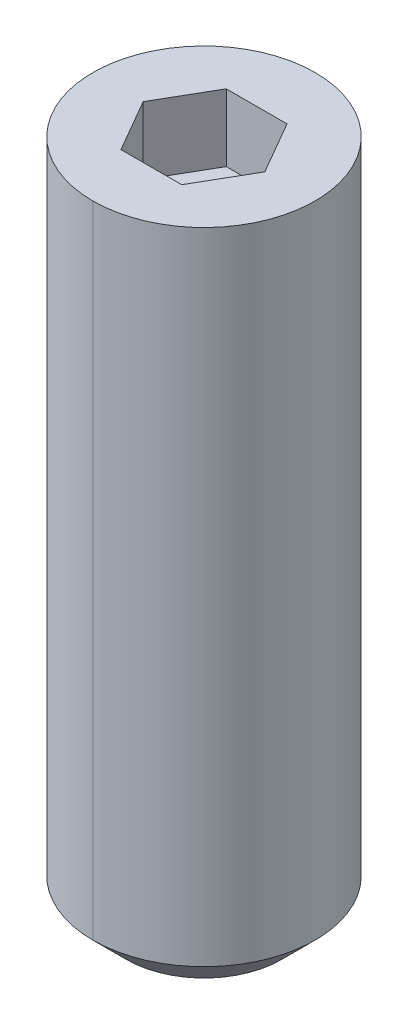
ISO-10303-21;
HEADER;
FILE_DESCRIPTION(('STEP AP214'),'2;1');
FILE_NAME('part.step','',(''),(''),'','','');
FILE_SCHEMA(('AUTOMOTIVE_DESIGN { 1 0 10303 214 1 1 1 1 }'));
ENDSEC;
DATA;
#1=APPLICATION_CONTEXT('core data for automotive mechanical design processes');
#2=APPLICATION_PROTOCOL_DEFINITION('international standard','automotive_design',2000,#1);
#3=PRODUCT_CONTEXT('',#1,'mechanical');
#4=PRODUCT('Part','Part','',(#3));
#5=PRODUCT_RELATED_PRODUCT_CATEGORY('part','',(#4));
#6=PRODUCT_DEFINITION_FORMATION('','',#4);
#7=PRODUCT_DEFINITION_CONTEXT('part definition',#1,'design');
#8=PRODUCT_DEFINITION('design','',#6,#7);
#9=PRODUCT_DEFINITION_SHAPE('','',#8);
#10=(LENGTH_UNIT() NAMED_UNIT(*) SI_UNIT(.MILLI.,.METRE.));
#11=(NAMED_UNIT(*) PLANE_ANGLE_UNIT() SI_UNIT($,.RADIAN.));
#12=(NAMED_UNIT(*) SI_UNIT($,.STERADIAN.) SOLID_ANGLE_UNIT());
#13=UNCERTAINTY_MEASURE_WITH_UNIT(LENGTH_MEASURE(1.E-05),#10,'distance_accuracy_value','');
#14=(GEOMETRIC_REPRESENTATION_CONTEXT(3) GLOBAL_UNCERTAINTY_ASSIGNED_CONTEXT((#13)) GLOBAL_UNIT_ASSIGNED_CONTEXT((#10,
#11,#12)) REPRESENTATION_CONTEXT('',''));
#15=CARTESIAN_POINT('',(0.,0.,0.));
#16=DIRECTION('',(0.,0.,1.));
#17=DIRECTION('',(1.,0.,0.));
#18=AXIS2_PLACEMENT_3D('',#15,#16,#17);
#19=CARTESIAN_POINT('',(-1.14567944042316,5.08,0.));
#20=DIRECTION('',(0.,1.,0.));
#21=DIRECTION('',(1.,0.,0.));
#22=AXIS2_PLACEMENT_3D('',#19,#20,#21);
#23=PLANE('',#22);
#24=DIRECTION('',(-0.5,0.,0.866025403784439));
#25=VECTOR('',#24,1.);
#26=CARTESIAN_POINT('',(-0.572839720211583,5.08,-0.9921875));
#27=LINE('',#26,#25);
#28=CARTESIAN_POINT('',(-0.572839720211583,5.08,-0.9921875));
#29=VERTEX_POINT('',#28);
#30=CARTESIAN_POINT('',(-1.14567944042316,5.08,0.));
#31=VERTEX_POINT('',#30);
#32=EDGE_CURVE('E10',#29,#31,#27,.T.);
#33=ORIENTED_EDGE('',*,*,#32,.T.);
#34=DIRECTION('',(0.5,0.,0.866025403784439));
#35=VECTOR('',#34,1.);
#36=CARTESIAN_POINT('',(-1.14567944042316,5.08,0.));
#37=LINE('',#36,#35);
#38=CARTESIAN_POINT('',(-0.572839720211581,5.08,0.9921875));
#39=VERTEX_POINT('',#38);
#40=EDGE_CURVE('E164',#31,#39,#37,.T.);
#41=ORIENTED_EDGE('',*,*,#40,.T.);
#42=DIRECTION('',(1.,0.,0.));
#43=VECTOR('',#42,1.);
#44=CARTESIAN_POINT('',(-0.572839720211581,5.08,0.9921875));
#45=LINE('',#44,#43);
#46=CARTESIAN_POINT('',(0.572839720211582,5.08,0.9921875));
#47=VERTEX_POINT('',#46);
#48=EDGE_CURVE('E192',#39,#47,#45,.T.);
#49=ORIENTED_EDGE('',*,*,#48,.T.);
#50=DIRECTION('',(0.5,0.,-0.866025403784439));
#51=VECTOR('',#50,1.);
#52=CARTESIAN_POINT('',(0.572839720211582,5.08,0.9921875));
#53=LINE('',#52,#51);
#54=CARTESIAN_POINT('',(1.14567944042316,5.08,0.));
#55=VERTEX_POINT('',#54);
#56=EDGE_CURVE('E151',#47,#55,#53,.T.);
#57=ORIENTED_EDGE('',*,*,#56,.T.);
#58=DIRECTION('',(-0.5,0.,-0.866025403784438));
#59=VECTOR('',#58,1.);
#60=CARTESIAN_POINT('',(1.14567944042316,5.08,0.));
#61=LINE('',#60,#59);
#62=CARTESIAN_POINT('',(0.572839720211582,5.08,-0.9921875));
#63=VERTEX_POINT('',#62);
#64=EDGE_CURVE('E27',#55,#63,#61,.T.);
#65=ORIENTED_EDGE('',*,*,#64,.T.);
#66=DIRECTION('',(-1.,0.,0.));
#67=VECTOR('',#66,1.);
#68=CARTESIAN_POINT('',(0.572839720211582,5.08,-0.9921875));
#69=LINE('',#68,#67);
#70=EDGE_CURVE('E135',#63,#29,#69,.T.);
#71=ORIENTED_EDGE('',*,*,#70,.T.);
#72=EDGE_LOOP('',(#33,#41,#49,#57,#65,#71));
#73=FACE_BOUND('',#72,.T.);
#74=ADVANCED_FACE('F16',(#73),#23,.T.);
#75=CARTESIAN_POINT('',(-0.572839720211583,5.08,-0.9921875));
#76=DIRECTION('',(-0.866025403784439,0.,-0.5));
#77=DIRECTION('',(-0.5,0.,0.866025403784439));
#78=AXIS2_PLACEMENT_3D('',#75,#76,#77);
#79=PLANE('',#78);
#80=DIRECTION('',(-0.5,0.,0.866025403784439));
#81=VECTOR('',#80,1.);
#82=CARTESIAN_POINT('',(-0.572839720211583,6.35,-0.9921875));
#83=LINE('',#82,#81);
#84=CARTESIAN_POINT('',(-0.572839720211583,6.35,-0.9921875));
#85=VERTEX_POINT('',#84);
#86=CARTESIAN_POINT('',(-1.14567944042316,6.35,0.));
#87=VERTEX_POINT('',#86);
#88=EDGE_CURVE('E184',#85,#87,#83,.T.);
#89=ORIENTED_EDGE('',*,*,#88,.T.);
#90=DIRECTION('',(0.,1.,0.));
#91=VECTOR('',#90,1.);
#92=CARTESIAN_POINT('',(-1.14567944042316,5.08,0.));
#93=LINE('',#92,#91);
#94=EDGE_CURVE('E127',#31,#87,#93,.T.);
#95=ORIENTED_EDGE('',*,*,#94,.F.);
#96=ORIENTED_EDGE('',*,*,#32,.F.);
#97=DIRECTION('',(0.,1.,0.));
#98=VECTOR('',#97,1.);
#99=CARTESIAN_POINT('',(-0.572839720211583,5.08,-0.9921875));
#100=LINE('',#99,#98);
#101=EDGE_CURVE('E126',#29,#85,#100,.T.);
#102=ORIENTED_EDGE('',*,*,#101,.T.);
#103=EDGE_LOOP('',(#89,#95,#96,#102));
#104=FACE_BOUND('',#103,.T.);
#105=ADVANCED_FACE('F124',(#104),#79,.F.);
#106=CARTESIAN_POINT('',(1.14567944042316,5.08,0.));
#107=DIRECTION('',(0.866025403784438,0.,-0.5));
#108=DIRECTION('',(0.,-1.,0.));
#109=AXIS2_PLACEMENT_3D('',#106,#107,#108);
#110=PLANE('',#109);
#111=DIRECTION('',(-0.5,0.,-0.866025403784438));
#112=VECTOR('',#111,1.);
#113=CARTESIAN_POINT('',(1.14567944042316,6.35,0.));
#114=LINE('',#113,#112);
#115=CARTESIAN_POINT('',(1.14567944042316,6.35,0.));
#116=VERTEX_POINT('',#115);
#117=CARTESIAN_POINT('',(0.572839720211582,6.35,-0.9921875));
#118=VERTEX_POINT('',#117);
#119=EDGE_CURVE('E166',#116,#118,#114,.T.);
#120=ORIENTED_EDGE('',*,*,#119,.T.);
#121=DIRECTION('',(0.,1.,0.));
#122=VECTOR('',#121,1.);
#123=CARTESIAN_POINT('',(0.572839720211582,5.08,-0.9921875));
#124=LINE('',#123,#122);
#125=EDGE_CURVE('E140',#63,#118,#124,.T.);
#126=ORIENTED_EDGE('',*,*,#125,.F.);
#127=ORIENTED_EDGE('',*,*,#64,.F.);
#128=DIRECTION('',(0.,1.,0.));
#129=VECTOR('',#128,1.);
#130=CARTESIAN_POINT('',(1.14567944042316,5.08,0.));
#131=LINE('',#130,#129);
#132=EDGE_CURVE('E157',#55,#116,#131,.T.);
#133=ORIENTED_EDGE('',*,*,#132,.T.);
#134=EDGE_LOOP('',(#120,#126,#127,#133));
#135=FACE_BOUND('',#134,.T.);
#136=ADVANCED_FACE('F18',(#135),#110,.F.);
#137=CARTESIAN_POINT('',(-1.14567944042316,5.08,0.));
#138=DIRECTION('',(-0.866025403784438,0.,0.5));
#139=DIRECTION('',(0.,1.,0.));
#140=AXIS2_PLACEMENT_3D('',#137,#138,#139);
#141=PLANE('',#140);
#142=DIRECTION('',(0.5,0.,0.866025403784439));
#143=VECTOR('',#142,1.);
#144=CARTESIAN_POINT('',(-1.14567944042316,6.35,0.));
#145=LINE('',#144,#143);
#146=CARTESIAN_POINT('',(-0.572839720211581,6.35,0.9921875));
#147=VERTEX_POINT('',#146);
#148=EDGE_CURVE('E173',#87,#147,#145,.T.);
#149=ORIENTED_EDGE('',*,*,#148,.T.);
#150=DIRECTION('',(0.,1.,0.));
#151=VECTOR('',#150,1.);
#152=CARTESIAN_POINT('',(-0.572839720211581,5.08,0.9921875));
#153=LINE('',#152,#151);
#154=EDGE_CURVE('E169',#39,#147,#153,.T.);
#155=ORIENTED_EDGE('',*,*,#154,.F.);
#156=ORIENTED_EDGE('',*,*,#40,.F.);
#157=ORIENTED_EDGE('',*,*,#94,.T.);
#158=EDGE_LOOP('',(#149,#155,#156,#157));
#159=FACE_BOUND('',#158,.T.);
#160=ADVANCED_FACE('F308',(#159),#141,.F.);
#161=CARTESIAN_POINT('',(-0.572839720211581,5.08,0.9921875));
#162=DIRECTION('',(0.,0.,1.));
#163=DIRECTION('',(1.,0.,0.));
#164=AXIS2_PLACEMENT_3D('',#161,#162,#163);
#165=PLANE('',#164);
#166=DIRECTION('',(1.,0.,0.));
#167=VECTOR('',#166,1.);
#168=CARTESIAN_POINT('',(-0.572839720211581,6.35,0.9921875));
#169=LINE('',#168,#167);
#170=CARTESIAN_POINT('',(0.572839720211582,6.35,0.9921875));
#171=VERTEX_POINT('',#170);
#172=EDGE_CURVE('E154',#147,#171,#169,.T.);
#173=ORIENTED_EDGE('',*,*,#172,.T.);
#174=DIRECTION('',(0.,1.,0.));
#175=VECTOR('',#174,1.);
#176=CARTESIAN_POINT('',(0.572839720211582,5.08,0.9921875));
#177=LINE('',#176,#175);
#178=EDGE_CURVE('E145',#47,#171,#177,.T.);
#179=ORIENTED_EDGE('',*,*,#178,.F.);
#180=ORIENTED_EDGE('',*,*,#48,.F.);
#181=ORIENTED_EDGE('',*,*,#154,.T.);
#182=EDGE_LOOP('',(#173,#179,#180,#181));
#183=FACE_BOUND('',#182,.T.);
#184=ADVANCED_FACE('F300',(#183),#165,.F.);
#185=CARTESIAN_POINT('',(0.572839720211582,5.08,-0.9921875));
#186=DIRECTION('',(0.,0.,-1.));
#187=DIRECTION('',(0.,-1.,0.));
#188=AXIS2_PLACEMENT_3D('',#185,#186,#187);
#189=PLANE('',#188);
#190=DIRECTION('',(-1.,0.,0.));
#191=VECTOR('',#190,1.);
#192=CARTESIAN_POINT('',(0.572839720211582,6.35,-0.9921875));
#193=LINE('',#192,#191);
#194=EDGE_CURVE('E143',#118,#85,#193,.T.);
#195=ORIENTED_EDGE('',*,*,#194,.T.);
#196=ORIENTED_EDGE('',*,*,#101,.F.);
#197=ORIENTED_EDGE('',*,*,#70,.F.);
#198=ORIENTED_EDGE('',*,*,#125,.T.);
#199=EDGE_LOOP('',(#195,#196,#197,#198));
#200=FACE_BOUND('',#199,.T.);
#201=ADVANCED_FACE('F137',(#200),#189,.F.);
#202=CARTESIAN_POINT('',(0.572839720211582,5.08,0.9921875));
#203=DIRECTION('',(0.866025403784439,0.,0.5));
#204=DIRECTION('',(0.,-1.,0.));
#205=AXIS2_PLACEMENT_3D('',#202,#203,#204);
#206=PLANE('',#205);
#207=DIRECTION('',(0.5,0.,-0.866025403784439));
#208=VECTOR('',#207,1.);
#209=CARTESIAN_POINT('',(0.572839720211582,6.35,0.9921875));
#210=LINE('',#209,#208);
#211=EDGE_CURVE('E174',#171,#116,#210,.T.);
#212=ORIENTED_EDGE('',*,*,#211,.T.);
#213=ORIENTED_EDGE('',*,*,#132,.F.);
#214=ORIENTED_EDGE('',*,*,#56,.F.);
#215=ORIENTED_EDGE('',*,*,#178,.T.);
#216=EDGE_LOOP('',(#212,#213,#214,#215));
#217=FACE_BOUND('',#216,.T.);
#218=ADVANCED_FACE('F245',(#217),#206,.F.);
#219=CARTESIAN_POINT('',(0.,-6.35,0.));
#220=DIRECTION('',(0.,1.,0.));
#221=DIRECTION('',(1.,0.,0.));
#222=AXIS2_PLACEMENT_3D('',#219,#220,#221);
#223=PLANE('',#222);
#224=CARTESIAN_POINT('',(0.,-6.35,0.));
#225=DIRECTION('',(0.,-1.,0.));
#226=DIRECTION('',(0.,0.,1.));
#227=AXIS2_PLACEMENT_3D('',#224,#225,#226);
#228=CIRCLE('',#227,1.4605);
#229=CARTESIAN_POINT('',(0.,-6.35,1.4605));
#230=VERTEX_POINT('',#229);
#231=CARTESIAN_POINT('',(0.,-6.35,-1.4605));
#232=VERTEX_POINT('',#231);
#233=EDGE_CURVE('E161',#230,#232,#228,.T.);
#234=ORIENTED_EDGE('',*,*,#233,.T.);
#235=CARTESIAN_POINT('',(0.,-6.35,0.));
#236=DIRECTION('',(0.,-1.,0.));
#237=DIRECTION('',(0.,0.,1.));
#238=AXIS2_PLACEMENT_3D('',#235,#236,#237);
#239=CIRCLE('',#238,1.4605);
#240=EDGE_CURVE('E158',#232,#230,#239,.T.);
#241=ORIENTED_EDGE('',*,*,#240,.T.);
#242=EDGE_LOOP('',(#234,#241));
#243=FACE_BOUND('',#242,.T.);
#244=ADVANCED_FACE('F230',(#243),#223,.F.);
#245=CARTESIAN_POINT('',(0.,-5.715,0.));
#246=DIRECTION('',(0.,1.,0.));
#247=DIRECTION('',(0.,0.,1.));
#248=AXIS2_PLACEMENT_3D('',#245,#246,#247);
#249=CONICAL_SURFACE('',#248,2.0955,0.785398163397451);
#250=DIRECTION('',(0.,0.707106781186546,-0.70710678118655));
#251=VECTOR('',#250,1.);
#252=CARTESIAN_POINT('',(0.,-5.715,-2.0955));
#253=LINE('',#252,#251);
#254=CARTESIAN_POINT('',(0.,-5.715,-2.0955));
#255=VERTEX_POINT('',#254);
#256=EDGE_CURVE('E91',#232,#255,#253,.T.);
#257=ORIENTED_EDGE('',*,*,#256,.F.);
#258=ORIENTED_EDGE('',*,*,#233,.F.);
#259=DIRECTION('',(0.,0.707106781186546,0.70710678118655));
#260=VECTOR('',#259,1.);
#261=CARTESIAN_POINT('',(0.,-5.715,2.0955));
#262=LINE('',#261,#260);
#263=CARTESIAN_POINT('',(0.,-5.715,2.0955));
#264=VERTEX_POINT('',#263);
#265=EDGE_CURVE('E83',#230,#264,#262,.T.);
#266=ORIENTED_EDGE('',*,*,#265,.T.);
#267=CARTESIAN_POINT('',(0.,-5.715,0.));
#268=DIRECTION('',(0.,1.,0.));
#269=DIRECTION('',(0.,0.,1.));
#270=AXIS2_PLACEMENT_3D('',#267,#268,#269);
#271=CIRCLE('',#270,2.0955);
#272=EDGE_CURVE('E156',#255,#264,#271,.T.);
#273=ORIENTED_EDGE('',*,*,#272,.F.);
#274=EDGE_LOOP('',(#257,#258,#266,#273));
#275=FACE_BOUND('',#274,.T.);
#276=ADVANCED_FACE('F231',(#275),#249,.T.);
#277=CARTESIAN_POINT('',(0.,6.35,0.));
#278=DIRECTION('',(0.,1.,0.));
#279=DIRECTION('',(1.,0.,0.));
#280=AXIS2_PLACEMENT_3D('',#277,#278,#279);
#281=PLANE('',#280);
#282=ORIENTED_EDGE('',*,*,#88,.F.);
#283=ORIENTED_EDGE('',*,*,#194,.F.);
#284=ORIENTED_EDGE('',*,*,#119,.F.);
#285=ORIENTED_EDGE('',*,*,#211,.F.);
#286=ORIENTED_EDGE('',*,*,#172,.F.);
#287=ORIENTED_EDGE('',*,*,#148,.F.);
#288=EDGE_LOOP('',(#282,#283,#284,#285,#286,#287));
#289=FACE_BOUND('',#288,.T.);
#290=CARTESIAN_POINT('',(0.,6.35,0.));
#291=DIRECTION('',(0.,1.,0.));
#292=DIRECTION('',(0.,0.,1.));
#293=AXIS2_PLACEMENT_3D('',#290,#291,#292);
#294=CIRCLE('',#293,2.0955);
#295=CARTESIAN_POINT('',(0.,6.35,-2.0955));
#296=VERTEX_POINT('',#295);
#297=CARTESIAN_POINT('',(0.,6.35,2.0955));
#298=VERTEX_POINT('',#297);
#299=EDGE_CURVE('E73',#296,#298,#294,.T.);
#300=ORIENTED_EDGE('',*,*,#299,.T.);
#301=CARTESIAN_POINT('',(0.,6.35,0.));
#302=DIRECTION('',(0.,1.,0.));
#303=DIRECTION('',(0.,0.,1.));
#304=AXIS2_PLACEMENT_3D('',#301,#302,#303);
#305=CIRCLE('',#304,2.0955);
#306=EDGE_CURVE('E178',#298,#296,#305,.T.);
#307=ORIENTED_EDGE('',*,*,#306,.T.);
#308=EDGE_LOOP('',(#300,#307));
#309=FACE_BOUND('',#308,.T.);
#310=ADVANCED_FACE('F233',(#289,#309),#281,.T.);
#311=CARTESIAN_POINT('',(0.,-5.715,0.));
#312=DIRECTION('',(0.,1.,0.));
#313=DIRECTION('',(0.,0.,1.));
#314=AXIS2_PLACEMENT_3D('',#311,#312,#313);
#315=CONICAL_SURFACE('',#314,2.0955,0.785398163397451);
#316=ORIENTED_EDGE('',*,*,#240,.F.);
#317=ORIENTED_EDGE('',*,*,#256,.T.);
#318=CARTESIAN_POINT('',(0.,-5.715,0.));
#319=DIRECTION('',(0.,1.,0.));
#320=DIRECTION('',(0.,0.,1.));
#321=AXIS2_PLACEMENT_3D('',#318,#319,#320);
#322=CIRCLE('',#321,2.0955);
#323=EDGE_CURVE('E191',#264,#255,#322,.T.);
#324=ORIENTED_EDGE('',*,*,#323,.F.);
#325=ORIENTED_EDGE('',*,*,#265,.F.);
#326=EDGE_LOOP('',(#316,#317,#324,#325));
#327=FACE_BOUND('',#326,.T.);
#328=ADVANCED_FACE('F229',(#327),#315,.T.);
#329=CARTESIAN_POINT('',(0.,6.35,0.));
#330=DIRECTION('',(0.,-1.,0.));
#331=DIRECTION('',(0.,0.,-1.));
#332=AXIS2_PLACEMENT_3D('',#329,#330,#331);
#333=CYLINDRICAL_SURFACE('',#332,2.0955);
#334=DIRECTION('',(0.,-1.,0.));
#335=VECTOR('',#334,1.);
#336=CARTESIAN_POINT('',(0.,6.35,2.0955));
#337=LINE('',#336,#335);
#338=EDGE_CURVE('E181',#298,#264,#337,.T.);
#339=ORIENTED_EDGE('',*,*,#338,.F.);
#340=ORIENTED_EDGE('',*,*,#299,.F.);
#341=DIRECTION('',(0.,-1.,0.));
#342=VECTOR('',#341,1.);
#343=CARTESIAN_POINT('',(0.,6.35,-2.0955));
#344=LINE('',#343,#342);
#345=EDGE_CURVE('E206',#296,#255,#344,.T.);
#346=ORIENTED_EDGE('',*,*,#345,.T.);
#347=ORIENTED_EDGE('',*,*,#272,.T.);
#348=EDGE_LOOP('',(#339,#340,#346,#347));
#349=FACE_BOUND('',#348,.T.);
#350=ADVANCED_FACE('F221',(#349),#333,.T.);
#351=CARTESIAN_POINT('',(0.,6.35,0.));
#352=DIRECTION('',(0.,-1.,0.));
#353=DIRECTION('',(0.,0.,-1.));
#354=AXIS2_PLACEMENT_3D('',#351,#352,#353);
#355=CYLINDRICAL_SURFACE('',#354,2.0955);
#356=ORIENTED_EDGE('',*,*,#306,.F.);
#357=ORIENTED_EDGE('',*,*,#338,.T.);
#358=ORIENTED_EDGE('',*,*,#323,.T.);
#359=ORIENTED_EDGE('',*,*,#345,.F.);
#360=EDGE_LOOP('',(#356,#357,#358,#359));
#361=FACE_BOUND('',#360,.T.);
#362=ADVANCED_FACE('F227',(#361),#355,.T.);
#363=CLOSED_SHELL('',(#74,#105,#136,#160,#184,#201,#218,#244,#276,#310,#328,#350,#362));
#364=MANIFOLD_SOLID_BREP('B1',#363);
#365=ADVANCED_BREP_SHAPE_REPRESENTATION('',(#18,#364),#14);
#366=SHAPE_DEFINITION_REPRESENTATION(#9,#365);
ENDSEC;
END-ISO-10303-21;
